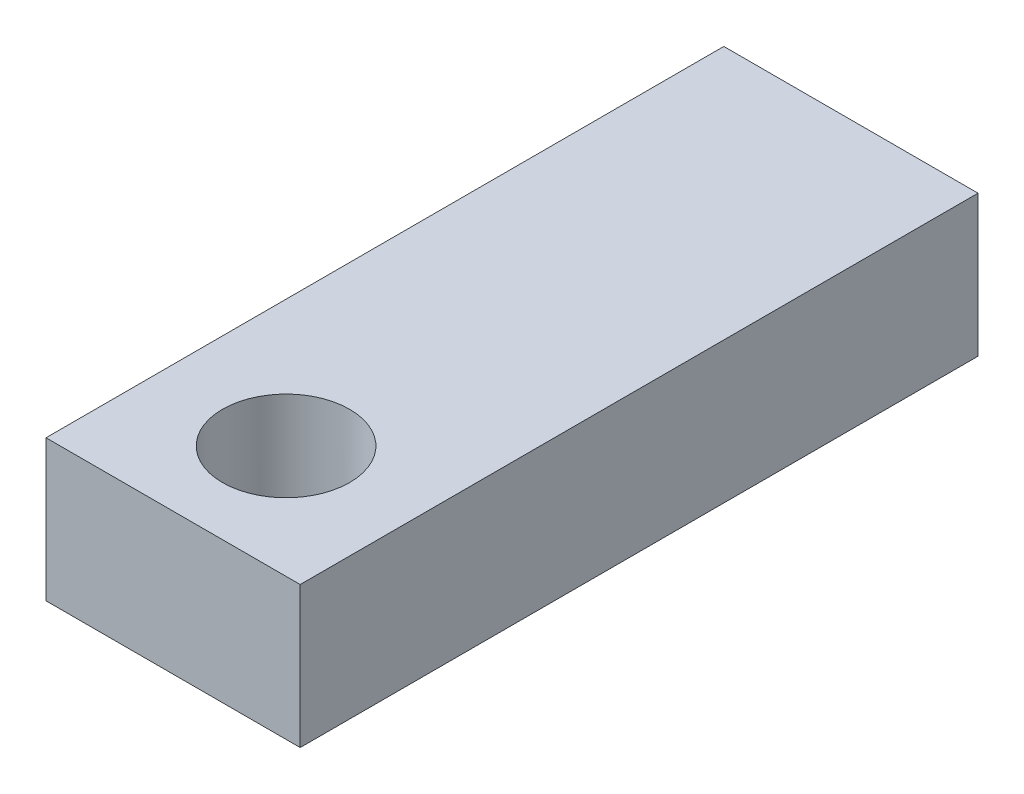
ISO-10303-21;
HEADER;
FILE_DESCRIPTION(('STEP AP214'),'2;1');
FILE_NAME('part.step','',(''),(''),'','','');
FILE_SCHEMA(('AUTOMOTIVE_DESIGN { 1 0 10303 214 1 1 1 1 }'));
ENDSEC;
DATA;
#1=APPLICATION_CONTEXT('core data for automotive mechanical design processes');
#2=APPLICATION_PROTOCOL_DEFINITION('international standard','automotive_design',2000,#1);
#3=PRODUCT_CONTEXT('',#1,'mechanical');
#4=PRODUCT('Part','Part','',(#3));
#5=PRODUCT_RELATED_PRODUCT_CATEGORY('part','',(#4));
#6=PRODUCT_DEFINITION_FORMATION('','',#4);
#7=PRODUCT_DEFINITION_CONTEXT('part definition',#1,'design');
#8=PRODUCT_DEFINITION('design','',#6,#7);
#9=PRODUCT_DEFINITION_SHAPE('','',#8);
#10=(LENGTH_UNIT() NAMED_UNIT(*) SI_UNIT(.MILLI.,.METRE.));
#11=(NAMED_UNIT(*) PLANE_ANGLE_UNIT() SI_UNIT($,.RADIAN.));
#12=(NAMED_UNIT(*) SI_UNIT($,.STERADIAN.) SOLID_ANGLE_UNIT());
#13=UNCERTAINTY_MEASURE_WITH_UNIT(LENGTH_MEASURE(1.E-05),#10,'distance_accuracy_value','');
#14=(GEOMETRIC_REPRESENTATION_CONTEXT(3) GLOBAL_UNCERTAINTY_ASSIGNED_CONTEXT((#13)) GLOBAL_UNIT_ASSIGNED_CONTEXT((#10,
#11,#12)) REPRESENTATION_CONTEXT('',''));
#15=CARTESIAN_POINT('',(0.,0.,0.));
#16=DIRECTION('',(0.,0.,1.));
#17=DIRECTION('',(1.,0.,0.));
#18=AXIS2_PLACEMENT_3D('',#15,#16,#17);
#19=CARTESIAN_POINT('',(-4.5,-2.5,24.));
#20=DIRECTION('',(1.,0.,0.));
#21=DIRECTION('',(0.,0.,-1.));
#22=AXIS2_PLACEMENT_3D('',#19,#20,#21);
#23=PLANE('',#22);
#24=DIRECTION('',(0.,-1.,0.));
#25=VECTOR('',#24,1.);
#26=CARTESIAN_POINT('',(-4.5,-2.5,0.));
#27=LINE('',#26,#25);
#28=CARTESIAN_POINT('',(-4.5,2.5,0.));
#29=VERTEX_POINT('',#28);
#30=CARTESIAN_POINT('',(-4.5,-2.5,0.));
#31=VERTEX_POINT('',#30);
#32=EDGE_CURVE('E144',#29,#31,#27,.T.);
#33=ORIENTED_EDGE('',*,*,#32,.T.);
#34=DIRECTION('',(0.,0.,-1.));
#35=VECTOR('',#34,1.);
#36=CARTESIAN_POINT('',(-4.5,-2.5,24.));
#37=LINE('',#36,#35);
#38=CARTESIAN_POINT('',(-4.5,-2.5,24.));
#39=VERTEX_POINT('',#38);
#40=EDGE_CURVE('E11',#39,#31,#37,.T.);
#41=ORIENTED_EDGE('',*,*,#40,.F.);
#42=DIRECTION('',(0.,-1.,0.));
#43=VECTOR('',#42,1.);
#44=CARTESIAN_POINT('',(-4.5,-2.5,24.));
#45=LINE('',#44,#43);
#46=CARTESIAN_POINT('',(-4.5,2.5,24.));
#47=VERTEX_POINT('',#46);
#48=EDGE_CURVE('E148',#47,#39,#45,.T.);
#49=ORIENTED_EDGE('',*,*,#48,.F.);
#50=DIRECTION('',(0.,0.,-1.));
#51=VECTOR('',#50,1.);
#52=CARTESIAN_POINT('',(-4.5,2.5,24.));
#53=LINE('',#52,#51);
#54=EDGE_CURVE('E154',#47,#29,#53,.T.);
#55=ORIENTED_EDGE('',*,*,#54,.T.);
#56=EDGE_LOOP('',(#33,#41,#49,#55));
#57=FACE_BOUND('',#56,.T.);
#58=ADVANCED_FACE('F33',(#57),#23,.F.);
#59=CARTESIAN_POINT('',(4.5,-2.5,24.));
#60=DIRECTION('',(0.,1.,0.));
#61=DIRECTION('',(-1.,0.,0.));
#62=AXIS2_PLACEMENT_3D('',#59,#60,#61);
#63=PLANE('',#62);
#64=CARTESIAN_POINT('',(0.,-2.5,20.));
#65=DIRECTION('',(0.,1.,0.));
#66=DIRECTION('',(-1.,0.,0.));
#67=AXIS2_PLACEMENT_3D('',#64,#65,#66);
#68=CIRCLE('',#67,2.25);
#69=CARTESIAN_POINT('',(-2.25,-2.5,20.));
#70=VERTEX_POINT('',#69);
#71=EDGE_CURVE('E132',#70,#70,#68,.T.);
#72=ORIENTED_EDGE('',*,*,#71,.T.);
#73=EDGE_LOOP('',(#72));
#74=FACE_BOUND('',#73,.T.);
#75=DIRECTION('',(1.,0.,0.));
#76=VECTOR('',#75,1.);
#77=CARTESIAN_POINT('',(4.5,-2.5,0.));
#78=LINE('',#77,#76);
#79=CARTESIAN_POINT('',(4.5,-2.5,0.));
#80=VERTEX_POINT('',#79);
#81=EDGE_CURVE('E157',#31,#80,#78,.T.);
#82=ORIENTED_EDGE('',*,*,#81,.T.);
#83=DIRECTION('',(0.,0.,-1.));
#84=VECTOR('',#83,1.);
#85=CARTESIAN_POINT('',(4.5,-2.5,24.));
#86=LINE('',#85,#84);
#87=CARTESIAN_POINT('',(4.5,-2.5,24.));
#88=VERTEX_POINT('',#87);
#89=EDGE_CURVE('E40',#88,#80,#86,.T.);
#90=ORIENTED_EDGE('',*,*,#89,.F.);
#91=DIRECTION('',(1.,0.,0.));
#92=VECTOR('',#91,1.);
#93=CARTESIAN_POINT('',(4.5,-2.5,24.));
#94=LINE('',#93,#92);
#95=EDGE_CURVE('E84',#39,#88,#94,.T.);
#96=ORIENTED_EDGE('',*,*,#95,.F.);
#97=ORIENTED_EDGE('',*,*,#40,.T.);
#98=EDGE_LOOP('',(#82,#90,#96,#97));
#99=FACE_BOUND('',#98,.T.);
#100=ADVANCED_FACE('F186',(#74,#99),#63,.F.);
#101=CARTESIAN_POINT('',(4.5,-2.5,24.));
#102=DIRECTION('',(-1.,0.,0.));
#103=DIRECTION('',(0.,0.,1.));
#104=AXIS2_PLACEMENT_3D('',#101,#102,#103);
#105=PLANE('',#104);
#106=DIRECTION('',(0.,1.,0.));
#107=VECTOR('',#106,1.);
#108=CARTESIAN_POINT('',(4.5,-2.5,0.));
#109=LINE('',#108,#107);
#110=CARTESIAN_POINT('',(4.5,2.5,0.));
#111=VERTEX_POINT('',#110);
#112=EDGE_CURVE('E159',#80,#111,#109,.T.);
#113=ORIENTED_EDGE('',*,*,#112,.T.);
#114=DIRECTION('',(0.,0.,-1.));
#115=VECTOR('',#114,1.);
#116=CARTESIAN_POINT('',(4.5,2.5,24.));
#117=LINE('',#116,#115);
#118=CARTESIAN_POINT('',(4.5,2.5,24.));
#119=VERTEX_POINT('',#118);
#120=EDGE_CURVE('E163',#119,#111,#117,.T.);
#121=ORIENTED_EDGE('',*,*,#120,.F.);
#122=DIRECTION('',(0.,1.,0.));
#123=VECTOR('',#122,1.);
#124=CARTESIAN_POINT('',(4.5,-2.5,24.));
#125=LINE('',#124,#123);
#126=EDGE_CURVE('E151',#88,#119,#125,.T.);
#127=ORIENTED_EDGE('',*,*,#126,.F.);
#128=ORIENTED_EDGE('',*,*,#89,.T.);
#129=EDGE_LOOP('',(#113,#121,#127,#128));
#130=FACE_BOUND('',#129,.T.);
#131=ADVANCED_FACE('F168',(#130),#105,.F.);
#132=CARTESIAN_POINT('',(4.5,2.5,24.));
#133=DIRECTION('',(0.,-1.,0.));
#134=DIRECTION('',(1.,0.,0.));
#135=AXIS2_PLACEMENT_3D('',#132,#133,#134);
#136=PLANE('',#135);
#137=CARTESIAN_POINT('',(0.,2.5,20.));
#138=DIRECTION('',(0.,1.,0.));
#139=DIRECTION('',(1.,0.,0.));
#140=AXIS2_PLACEMENT_3D('',#137,#138,#139);
#141=CIRCLE('',#140,2.25);
#142=CARTESIAN_POINT('',(2.25,2.5,20.));
#143=VERTEX_POINT('',#142);
#144=EDGE_CURVE('E200',#143,#143,#141,.T.);
#145=ORIENTED_EDGE('',*,*,#144,.F.);
#146=EDGE_LOOP('',(#145));
#147=FACE_BOUND('',#146,.T.);
#148=DIRECTION('',(-1.,0.,0.));
#149=VECTOR('',#148,1.);
#150=CARTESIAN_POINT('',(4.5,2.5,0.));
#151=LINE('',#150,#149);
#152=EDGE_CURVE('E77',#111,#29,#151,.T.);
#153=ORIENTED_EDGE('',*,*,#152,.T.);
#154=ORIENTED_EDGE('',*,*,#54,.F.);
#155=DIRECTION('',(-1.,0.,0.));
#156=VECTOR('',#155,1.);
#157=CARTESIAN_POINT('',(4.5,2.5,24.));
#158=LINE('',#157,#156);
#159=EDGE_CURVE('E56',#119,#47,#158,.T.);
#160=ORIENTED_EDGE('',*,*,#159,.F.);
#161=ORIENTED_EDGE('',*,*,#120,.T.);
#162=EDGE_LOOP('',(#153,#154,#160,#161));
#163=FACE_BOUND('',#162,.T.);
#164=ADVANCED_FACE('F176',(#147,#163),#136,.F.);
#165=CARTESIAN_POINT('',(0.,0.,24.));
#166=DIRECTION('',(0.,0.,1.));
#167=DIRECTION('',(1.,0.,0.));
#168=AXIS2_PLACEMENT_3D('',#165,#166,#167);
#169=PLANE('',#168);
#170=ORIENTED_EDGE('',*,*,#48,.T.);
#171=ORIENTED_EDGE('',*,*,#95,.T.);
#172=ORIENTED_EDGE('',*,*,#126,.T.);
#173=ORIENTED_EDGE('',*,*,#159,.T.);
#174=EDGE_LOOP('',(#170,#171,#172,#173));
#175=FACE_BOUND('',#174,.T.);
#176=ADVANCED_FACE('F178',(#175),#169,.T.);
#177=CARTESIAN_POINT('',(0.,0.,0.));
#178=DIRECTION('',(0.,0.,1.));
#179=DIRECTION('',(1.,0.,0.));
#180=AXIS2_PLACEMENT_3D('',#177,#178,#179);
#181=PLANE('',#180);
#182=DIRECTION('',(-1.,0.,0.));
#183=VECTOR('',#182,1.);
#184=CARTESIAN_POINT('',(-3.75,-1.75,0.));
#185=LINE('',#184,#183);
#186=CARTESIAN_POINT('',(3.75,-1.75,0.));
#187=VERTEX_POINT('',#186);
#188=CARTESIAN_POINT('',(-3.75,-1.75,0.));
#189=VERTEX_POINT('',#188);
#190=EDGE_CURVE('E138',#187,#189,#185,.T.);
#191=ORIENTED_EDGE('',*,*,#190,.F.);
#192=DIRECTION('',(0.,-1.,0.));
#193=VECTOR('',#192,1.);
#194=CARTESIAN_POINT('',(3.75,-1.75,0.));
#195=LINE('',#194,#193);
#196=CARTESIAN_POINT('',(3.75,1.75,0.));
#197=VERTEX_POINT('',#196);
#198=EDGE_CURVE('E47',#197,#187,#195,.T.);
#199=ORIENTED_EDGE('',*,*,#198,.F.);
#200=DIRECTION('',(1.,0.,0.));
#201=VECTOR('',#200,1.);
#202=CARTESIAN_POINT('',(-3.75,1.75,0.));
#203=LINE('',#202,#201);
#204=CARTESIAN_POINT('',(-3.75,1.75,0.));
#205=VERTEX_POINT('',#204);
#206=EDGE_CURVE('E126',#205,#197,#203,.T.);
#207=ORIENTED_EDGE('',*,*,#206,.F.);
#208=DIRECTION('',(0.,1.,0.));
#209=VECTOR('',#208,1.);
#210=CARTESIAN_POINT('',(-3.75,-1.75,0.));
#211=LINE('',#210,#209);
#212=EDGE_CURVE('E129',#189,#205,#211,.T.);
#213=ORIENTED_EDGE('',*,*,#212,.F.);
#214=EDGE_LOOP('',(#191,#199,#207,#213));
#215=FACE_BOUND('',#214,.T.);
#216=ORIENTED_EDGE('',*,*,#32,.F.);
#217=ORIENTED_EDGE('',*,*,#152,.F.);
#218=ORIENTED_EDGE('',*,*,#112,.F.);
#219=ORIENTED_EDGE('',*,*,#81,.F.);
#220=EDGE_LOOP('',(#216,#217,#218,#219));
#221=FACE_BOUND('',#220,.T.);
#222=ADVANCED_FACE('F172',(#215,#221),#181,.F.);
#223=CARTESIAN_POINT('',(3.75,-1.75,9.));
#224=DIRECTION('',(1.,0.,0.));
#225=DIRECTION('',(0.,0.,-1.));
#226=AXIS2_PLACEMENT_3D('',#223,#224,#225);
#227=PLANE('',#226);
#228=ORIENTED_EDGE('',*,*,#198,.T.);
#229=DIRECTION('',(0.,0.,-1.));
#230=VECTOR('',#229,1.);
#231=CARTESIAN_POINT('',(3.75,-1.75,9.));
#232=LINE('',#231,#230);
#233=CARTESIAN_POINT('',(3.75,-1.75,9.));
#234=VERTEX_POINT('',#233);
#235=EDGE_CURVE('E104',#234,#187,#232,.T.);
#236=ORIENTED_EDGE('',*,*,#235,.F.);
#237=DIRECTION('',(0.,-1.,0.));
#238=VECTOR('',#237,1.);
#239=CARTESIAN_POINT('',(3.75,-1.75,9.));
#240=LINE('',#239,#238);
#241=CARTESIAN_POINT('',(3.75,1.75,9.));
#242=VERTEX_POINT('',#241);
#243=EDGE_CURVE('E108',#242,#234,#240,.T.);
#244=ORIENTED_EDGE('',*,*,#243,.F.);
#245=DIRECTION('',(0.,0.,-1.));
#246=VECTOR('',#245,1.);
#247=CARTESIAN_POINT('',(3.75,1.75,9.));
#248=LINE('',#247,#246);
#249=EDGE_CURVE('E142',#242,#197,#248,.T.);
#250=ORIENTED_EDGE('',*,*,#249,.T.);
#251=EDGE_LOOP('',(#228,#236,#244,#250));
#252=FACE_BOUND('',#251,.T.);
#253=ADVANCED_FACE('F106',(#252),#227,.F.);
#254=CARTESIAN_POINT('',(-3.75,1.75,9.));
#255=DIRECTION('',(0.,1.,0.));
#256=DIRECTION('',(-1.,0.,0.));
#257=AXIS2_PLACEMENT_3D('',#254,#255,#256);
#258=PLANE('',#257);
#259=ORIENTED_EDGE('',*,*,#206,.T.);
#260=ORIENTED_EDGE('',*,*,#249,.F.);
#261=DIRECTION('',(1.,0.,0.));
#262=VECTOR('',#261,1.);
#263=CARTESIAN_POINT('',(-3.75,1.75,9.));
#264=LINE('',#263,#262);
#265=CARTESIAN_POINT('',(-3.75,1.75,9.));
#266=VERTEX_POINT('',#265);
#267=EDGE_CURVE('E114',#266,#242,#264,.T.);
#268=ORIENTED_EDGE('',*,*,#267,.F.);
#269=DIRECTION('',(0.,0.,-1.));
#270=VECTOR('',#269,1.);
#271=CARTESIAN_POINT('',(-3.75,1.75,9.));
#272=LINE('',#271,#270);
#273=EDGE_CURVE('E145',#266,#205,#272,.T.);
#274=ORIENTED_EDGE('',*,*,#273,.T.);
#275=EDGE_LOOP('',(#259,#260,#268,#274));
#276=FACE_BOUND('',#275,.T.);
#277=ADVANCED_FACE('F211',(#276),#258,.F.);
#278=CARTESIAN_POINT('',(-3.75,-1.75,9.));
#279=DIRECTION('',(-1.,0.,0.));
#280=DIRECTION('',(0.,0.,1.));
#281=AXIS2_PLACEMENT_3D('',#278,#279,#280);
#282=PLANE('',#281);
#283=ORIENTED_EDGE('',*,*,#212,.T.);
#284=ORIENTED_EDGE('',*,*,#273,.F.);
#285=DIRECTION('',(0.,1.,0.));
#286=VECTOR('',#285,1.);
#287=CARTESIAN_POINT('',(-3.75,-1.75,9.));
#288=LINE('',#287,#286);
#289=CARTESIAN_POINT('',(-3.75,-1.75,9.));
#290=VERTEX_POINT('',#289);
#291=EDGE_CURVE('E122',#290,#266,#288,.T.);
#292=ORIENTED_EDGE('',*,*,#291,.F.);
#293=DIRECTION('',(0.,0.,-1.));
#294=VECTOR('',#293,1.);
#295=CARTESIAN_POINT('',(-3.75,-1.75,9.));
#296=LINE('',#295,#294);
#297=EDGE_CURVE('E113',#290,#189,#296,.T.);
#298=ORIENTED_EDGE('',*,*,#297,.T.);
#299=EDGE_LOOP('',(#283,#284,#292,#298));
#300=FACE_BOUND('',#299,.T.);
#301=ADVANCED_FACE('F214',(#300),#282,.F.);
#302=CARTESIAN_POINT('',(-3.75,-1.75,9.));
#303=DIRECTION('',(0.,-1.,0.));
#304=DIRECTION('',(1.,0.,0.));
#305=AXIS2_PLACEMENT_3D('',#302,#303,#304);
#306=PLANE('',#305);
#307=ORIENTED_EDGE('',*,*,#190,.T.);
#308=ORIENTED_EDGE('',*,*,#297,.F.);
#309=DIRECTION('',(-1.,0.,0.));
#310=VECTOR('',#309,1.);
#311=CARTESIAN_POINT('',(-3.75,-1.75,9.));
#312=LINE('',#311,#310);
#313=EDGE_CURVE('E117',#234,#290,#312,.T.);
#314=ORIENTED_EDGE('',*,*,#313,.F.);
#315=ORIENTED_EDGE('',*,*,#235,.T.);
#316=EDGE_LOOP('',(#307,#308,#314,#315));
#317=FACE_BOUND('',#316,.T.);
#318=ADVANCED_FACE('F118',(#317),#306,.F.);
#319=CARTESIAN_POINT('',(0.,0.,9.));
#320=DIRECTION('',(0.,0.,-1.));
#321=DIRECTION('',(-1.,0.,0.));
#322=AXIS2_PLACEMENT_3D('',#319,#320,#321);
#323=PLANE('',#322);
#324=ORIENTED_EDGE('',*,*,#243,.T.);
#325=ORIENTED_EDGE('',*,*,#313,.T.);
#326=ORIENTED_EDGE('',*,*,#291,.T.);
#327=ORIENTED_EDGE('',*,*,#267,.T.);
#328=EDGE_LOOP('',(#324,#325,#326,#327));
#329=FACE_BOUND('',#328,.T.);
#330=ADVANCED_FACE('F124',(#329),#323,.T.);
#331=CARTESIAN_POINT('',(0.,-6.5,20.));
#332=DIRECTION('',(0.,1.,0.));
#333=DIRECTION('',(-1.,0.,0.));
#334=AXIS2_PLACEMENT_3D('',#331,#332,#333);
#335=CYLINDRICAL_SURFACE('',#334,2.25);
#336=ORIENTED_EDGE('',*,*,#144,.T.);
#337=EDGE_LOOP('',(#336));
#338=FACE_BOUND('',#337,.T.);
#339=ORIENTED_EDGE('',*,*,#71,.F.);
#340=EDGE_LOOP('',(#339));
#341=FACE_BOUND('',#340,.T.);
#342=ADVANCED_FACE('F203',(#338,#341),#335,.F.);
#343=CLOSED_SHELL('',(#58,#100,#131,#164,#176,#222,#253,#277,#301,#318,#330,#342));
#344=MANIFOLD_SOLID_BREP('B2',#343);
#345=ADVANCED_BREP_SHAPE_REPRESENTATION('',(#18,#344),#14);
#346=SHAPE_DEFINITION_REPRESENTATION(#9,#345);
ENDSEC;
END-ISO-10303-21;
